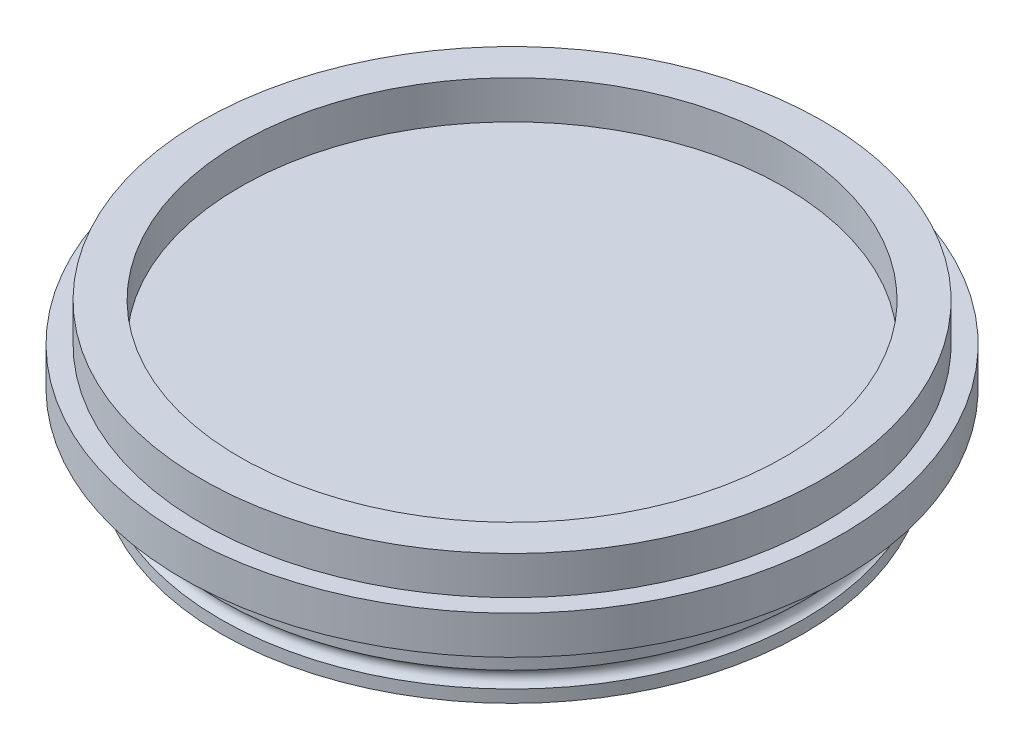
ISO-10303-21;
HEADER;
FILE_DESCRIPTION(('STEP AP214'),'2;1');
FILE_NAME('part.step','',(''),(''),'','','');
FILE_SCHEMA(('AUTOMOTIVE_DESIGN { 1 0 10303 214 1 1 1 1 }'));
ENDSEC;
DATA;
#1=APPLICATION_CONTEXT('core data for automotive mechanical design processes');
#2=APPLICATION_PROTOCOL_DEFINITION('international standard','automotive_design',2000,#1);
#3=PRODUCT_CONTEXT('',#1,'mechanical');
#4=PRODUCT('Part','Part','',(#3));
#5=PRODUCT_RELATED_PRODUCT_CATEGORY('part','',(#4));
#6=PRODUCT_DEFINITION_FORMATION('','',#4);
#7=PRODUCT_DEFINITION_CONTEXT('part definition',#1,'design');
#8=PRODUCT_DEFINITION('design','',#6,#7);
#9=PRODUCT_DEFINITION_SHAPE('','',#8);
#10=(LENGTH_UNIT() NAMED_UNIT(*) SI_UNIT(.MILLI.,.METRE.));
#11=(NAMED_UNIT(*) PLANE_ANGLE_UNIT() SI_UNIT($,.RADIAN.));
#12=(NAMED_UNIT(*) SI_UNIT($,.STERADIAN.) SOLID_ANGLE_UNIT());
#13=UNCERTAINTY_MEASURE_WITH_UNIT(LENGTH_MEASURE(1.E-05),#10,'distance_accuracy_value','');
#14=(GEOMETRIC_REPRESENTATION_CONTEXT(3) GLOBAL_UNCERTAINTY_ASSIGNED_CONTEXT((#13)) GLOBAL_UNIT_ASSIGNED_CONTEXT((#10,
#11,#12)) REPRESENTATION_CONTEXT('',''));
#15=CARTESIAN_POINT('',(0.,0.,0.));
#16=DIRECTION('',(0.,0.,1.));
#17=DIRECTION('',(1.,0.,0.));
#18=AXIS2_PLACEMENT_3D('',#15,#16,#17);
#19=CARTESIAN_POINT('',(0.,0.,0.));
#20=DIRECTION('',(0.,-1.,0.));
#21=DIRECTION('',(0.,0.,-1.));
#22=AXIS2_PLACEMENT_3D('',#19,#20,#21);
#23=CYLINDRICAL_SURFACE('',#22,109.5375);
#24=CARTESIAN_POINT('',(0.,1511.3,0.));
#25=DIRECTION('',(0.,-1.,0.));
#26=DIRECTION('',(0.,0.,-1.));
#27=AXIS2_PLACEMENT_3D('',#24,#25,#26);
#28=CIRCLE('',#27,109.537500000001);
#29=CARTESIAN_POINT('',(0.,1511.3,-109.537500000001));
#30=VERTEX_POINT('',#29);
#31=EDGE_CURVE('E67',#30,#30,#28,.T.);
#32=ORIENTED_EDGE('',*,*,#31,.F.);
#33=EDGE_LOOP('',(#32));
#34=FACE_BOUND('',#33,.T.);
#35=CARTESIAN_POINT('',(0.,1524.,0.));
#36=DIRECTION('',(0.,-1.,0.));
#37=DIRECTION('',(0.,0.,-1.));
#38=AXIS2_PLACEMENT_3D('',#35,#36,#37);
#39=CIRCLE('',#38,109.5375);
#40=CARTESIAN_POINT('',(0.,1524.,-109.5375));
#41=VERTEX_POINT('',#40);
#42=EDGE_CURVE('E10',#41,#41,#39,.T.);
#43=ORIENTED_EDGE('',*,*,#42,.T.);
#44=EDGE_LOOP('',(#43));
#45=FACE_BOUND('',#44,.T.);
#46=ADVANCED_FACE('F33',(#34,#45),#23,.T.);
#47=CARTESIAN_POINT('',(-109.5375,1524.,0.));
#48=DIRECTION('',(0.,-1.,0.));
#49=DIRECTION('',(0.,0.,-1.));
#50=AXIS2_PLACEMENT_3D('',#47,#48,#49);
#51=PLANE('',#50);
#52=ORIENTED_EDGE('',*,*,#42,.F.);
#53=EDGE_LOOP('',(#52));
#54=FACE_BOUND('',#53,.T.);
#55=CARTESIAN_POINT('',(0.,1524.,0.));
#56=DIRECTION('',(0.,-1.,0.));
#57=DIRECTION('',(0.,0.,-1.));
#58=AXIS2_PLACEMENT_3D('',#55,#56,#57);
#59=CIRCLE('',#58,103.1875);
#60=CARTESIAN_POINT('',(0.,1524.,-103.1875));
#61=VERTEX_POINT('',#60);
#62=EDGE_CURVE('E39',#61,#61,#59,.T.);
#63=ORIENTED_EDGE('',*,*,#62,.T.);
#64=EDGE_LOOP('',(#63));
#65=FACE_BOUND('',#64,.T.);
#66=ADVANCED_FACE('F74',(#54,#65),#51,.F.);
#67=CARTESIAN_POINT('',(0.,0.,0.));
#68=DIRECTION('',(0.,-1.,0.));
#69=DIRECTION('',(0.,0.,-1.));
#70=AXIS2_PLACEMENT_3D('',#67,#68,#69);
#71=CYLINDRICAL_SURFACE('',#70,103.1875);
#72=ORIENTED_EDGE('',*,*,#62,.F.);
#73=EDGE_LOOP('',(#72));
#74=FACE_BOUND('',#73,.T.);
#75=CARTESIAN_POINT('',(0.,1536.7,0.));
#76=DIRECTION('',(0.,-1.,0.));
#77=DIRECTION('',(0.,0.,-1.));
#78=AXIS2_PLACEMENT_3D('',#75,#76,#77);
#79=CIRCLE('',#78,103.1875);
#80=CARTESIAN_POINT('',(0.,1536.7,-103.1875));
#81=VERTEX_POINT('',#80);
#82=EDGE_CURVE('E43',#81,#81,#79,.T.);
#83=ORIENTED_EDGE('',*,*,#82,.T.);
#84=EDGE_LOOP('',(#83));
#85=FACE_BOUND('',#84,.T.);
#86=ADVANCED_FACE('F78',(#74,#85),#71,.T.);
#87=CARTESIAN_POINT('',(-103.1875,1536.7,0.));
#88=DIRECTION('',(0.,-1.,0.));
#89=DIRECTION('',(0.,0.,-1.));
#90=AXIS2_PLACEMENT_3D('',#87,#88,#89);
#91=PLANE('',#90);
#92=ORIENTED_EDGE('',*,*,#82,.F.);
#93=EDGE_LOOP('',(#92));
#94=FACE_BOUND('',#93,.T.);
#95=CARTESIAN_POINT('',(0.,1536.7,0.));
#96=DIRECTION('',(0.,-1.,0.));
#97=DIRECTION('',(0.,0.,-1.));
#98=AXIS2_PLACEMENT_3D('',#95,#96,#97);
#99=CIRCLE('',#98,90.4875000000003);
#100=CARTESIAN_POINT('',(0.,1536.7,-90.4875000000003));
#101=VERTEX_POINT('',#100);
#102=EDGE_CURVE('E47',#101,#101,#99,.T.);
#103=ORIENTED_EDGE('',*,*,#102,.T.);
#104=EDGE_LOOP('',(#103));
#105=FACE_BOUND('',#104,.T.);
#106=ADVANCED_FACE('F83',(#94,#105),#91,.F.);
#107=CARTESIAN_POINT('',(0.,0.,0.));
#108=DIRECTION('',(0.,-1.,0.));
#109=DIRECTION('',(0.,0.,-1.));
#110=AXIS2_PLACEMENT_3D('',#107,#108,#109);
#111=CYLINDRICAL_SURFACE('',#110,90.4875000000003);
#112=ORIENTED_EDGE('',*,*,#102,.F.);
#113=EDGE_LOOP('',(#112));
#114=FACE_BOUND('',#113,.T.);
#115=CARTESIAN_POINT('',(0.,1524.,0.));
#116=DIRECTION('',(0.,-1.,0.));
#117=DIRECTION('',(0.,0.,-1.));
#118=AXIS2_PLACEMENT_3D('',#115,#116,#117);
#119=CIRCLE('',#118,90.4875000000003);
#120=CARTESIAN_POINT('',(0.,1524.,-90.4875000000003));
#121=VERTEX_POINT('',#120);
#122=EDGE_CURVE('E52',#121,#121,#119,.T.);
#123=ORIENTED_EDGE('',*,*,#122,.T.);
#124=EDGE_LOOP('',(#123));
#125=FACE_BOUND('',#124,.T.);
#126=ADVANCED_FACE('F89',(#114,#125),#111,.F.);
#127=CARTESIAN_POINT('',(-90.4875000000003,1524.,0.));
#128=DIRECTION('',(0.,-1.,0.));
#129=DIRECTION('',(0.,0.,-1.));
#130=AXIS2_PLACEMENT_3D('',#127,#128,#129);
#131=PLANE('',#130);
#132=ORIENTED_EDGE('',*,*,#122,.F.);
#133=EDGE_LOOP('',(#132));
#134=FACE_BOUND('',#133,.T.);
#135=ADVANCED_FACE('F93',(#134),#131,.F.);
#136=CARTESIAN_POINT('',(-96.8375000000001,1489.075,0.));
#137=DIRECTION('',(0.,1.,0.));
#138=DIRECTION('',(0.,0.,1.));
#139=AXIS2_PLACEMENT_3D('',#136,#137,#138);
#140=PLANE('',#139);
#141=CARTESIAN_POINT('',(0.,1489.075,0.));
#142=DIRECTION('',(0.,-1.,0.));
#143=DIRECTION('',(0.,0.,-1.));
#144=AXIS2_PLACEMENT_3D('',#141,#142,#143);
#145=CIRCLE('',#144,96.8375000000001);
#146=CARTESIAN_POINT('',(0.,1489.075,-96.8375000000001));
#147=VERTEX_POINT('',#146);
#148=EDGE_CURVE('E55',#147,#147,#145,.T.);
#149=ORIENTED_EDGE('',*,*,#148,.T.);
#150=EDGE_LOOP('',(#149));
#151=FACE_BOUND('',#150,.T.);
#152=ADVANCED_FACE('F97',(#151),#140,.F.);
#153=CARTESIAN_POINT('',(0.,0.,0.));
#154=DIRECTION('',(0.,-1.,0.));
#155=DIRECTION('',(0.,0.,-1.));
#156=AXIS2_PLACEMENT_3D('',#153,#154,#155);
#157=CYLINDRICAL_SURFACE('',#156,96.8375000000002);
#158=ORIENTED_EDGE('',*,*,#148,.F.);
#159=EDGE_LOOP('',(#158));
#160=FACE_BOUND('',#159,.T.);
#161=CARTESIAN_POINT('',(0.,1493.18944226535,0.));
#162=DIRECTION('',(0.,-1.,0.));
#163=DIRECTION('',(0.,0.,-1.));
#164=AXIS2_PLACEMENT_3D('',#161,#162,#163);
#165=CIRCLE('',#164,96.8375000000002);
#166=CARTESIAN_POINT('',(0.,1493.18944226535,-96.8375000000002));
#167=VERTEX_POINT('',#166);
#168=EDGE_CURVE('E58',#167,#167,#165,.T.);
#169=ORIENTED_EDGE('',*,*,#168,.T.);
#170=EDGE_LOOP('',(#169));
#171=FACE_BOUND('',#170,.T.);
#172=ADVANCED_FACE('F101',(#160,#171),#157,.T.);
#173=CARTESIAN_POINT('',(0.,1495.89472113267,0.));
#174=DIRECTION('',(0.,-1.,0.));
#175=DIRECTION('',(0.,0.,-1.));
#176=AXIS2_PLACEMENT_3D('',#173,#174,#175);
#177=TOROIDAL_SURFACE('',#176,97.5360000000002,2.79399999999998);
#178=ORIENTED_EDGE('',*,*,#168,.F.);
#179=EDGE_LOOP('',(#178));
#180=FACE_BOUND('',#179,.T.);
#181=CARTESIAN_POINT('',(0.,1498.6,0.));
#182=DIRECTION('',(0.,-1.,0.));
#183=DIRECTION('',(0.,0.,-1.));
#184=AXIS2_PLACEMENT_3D('',#181,#182,#183);
#185=CIRCLE('',#184,96.8375000000001);
#186=CARTESIAN_POINT('',(0.,1498.6,-96.8375000000001));
#187=VERTEX_POINT('',#186);
#188=EDGE_CURVE('E61',#187,#187,#185,.T.);
#189=ORIENTED_EDGE('',*,*,#188,.T.);
#190=EDGE_LOOP('',(#189));
#191=FACE_BOUND('',#190,.T.);
#192=ADVANCED_FACE('F105',(#180,#191),#177,.F.);
#193=CARTESIAN_POINT('',(0.,0.,0.));
#194=DIRECTION('',(0.,-1.,0.));
#195=DIRECTION('',(0.,0.,-1.));
#196=AXIS2_PLACEMENT_3D('',#193,#194,#195);
#197=CYLINDRICAL_SURFACE('',#196,96.8375000000001);
#198=ORIENTED_EDGE('',*,*,#188,.F.);
#199=EDGE_LOOP('',(#198));
#200=FACE_BOUND('',#199,.T.);
#201=CARTESIAN_POINT('',(0.,1511.3,0.));
#202=DIRECTION('',(0.,-1.,0.));
#203=DIRECTION('',(0.,0.,-1.));
#204=AXIS2_PLACEMENT_3D('',#201,#202,#203);
#205=CIRCLE('',#204,96.8375000000001);
#206=CARTESIAN_POINT('',(0.,1511.3,-96.8375000000001));
#207=VERTEX_POINT('',#206);
#208=EDGE_CURVE('E64',#207,#207,#205,.T.);
#209=ORIENTED_EDGE('',*,*,#208,.T.);
#210=EDGE_LOOP('',(#209));
#211=FACE_BOUND('',#210,.T.);
#212=ADVANCED_FACE('F109',(#200,#211),#197,.T.);
#213=CARTESIAN_POINT('',(-109.537500000001,1511.3,0.));
#214=DIRECTION('',(0.,1.,0.));
#215=DIRECTION('',(0.,0.,1.));
#216=AXIS2_PLACEMENT_3D('',#213,#214,#215);
#217=PLANE('',#216);
#218=ORIENTED_EDGE('',*,*,#208,.F.);
#219=EDGE_LOOP('',(#218));
#220=FACE_BOUND('',#219,.T.);
#221=ORIENTED_EDGE('',*,*,#31,.T.);
#222=EDGE_LOOP('',(#221));
#223=FACE_BOUND('',#222,.T.);
#224=ADVANCED_FACE('F71',(#220,#223),#217,.F.);
#225=CLOSED_SHELL('',(#46,#66,#86,#106,#126,#135,#152,#172,#192,#212,#224));
#226=MANIFOLD_SOLID_BREP('B2',#225);
#227=ADVANCED_BREP_SHAPE_REPRESENTATION('',(#18,#226),#14);
#228=SHAPE_DEFINITION_REPRESENTATION(#9,#227);
ENDSEC;
END-ISO-10303-21;
